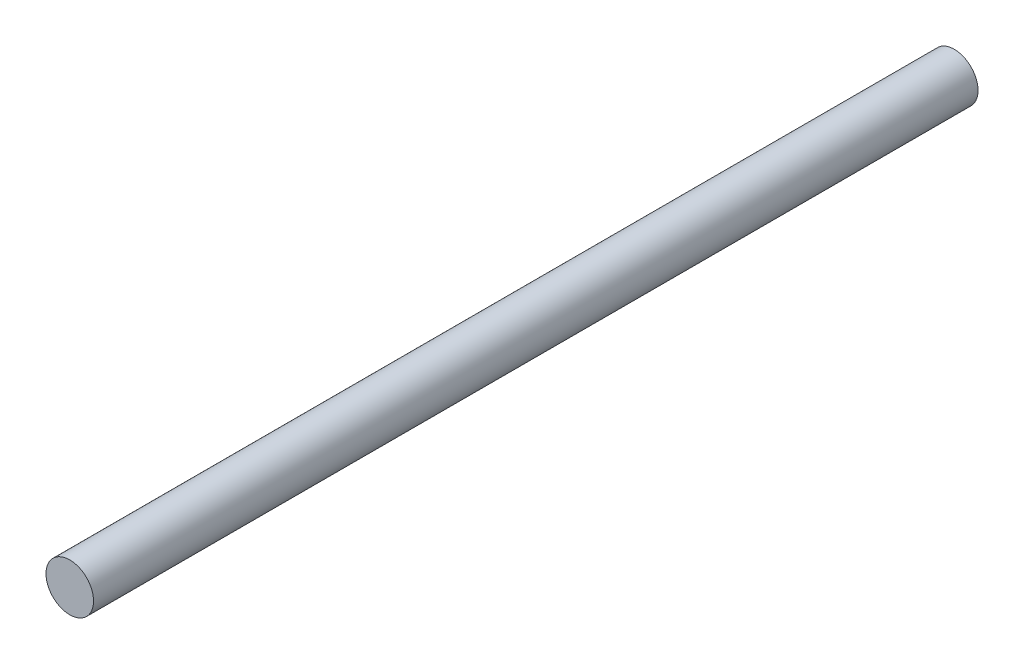
ISO-10303-21;
HEADER;
FILE_DESCRIPTION(('STEP AP214'),'2;1');
FILE_NAME('part.step','',(''),(''),'','','');
FILE_SCHEMA(('AUTOMOTIVE_DESIGN { 1 0 10303 214 1 1 1 1 }'));
ENDSEC;
DATA;
#1=APPLICATION_CONTEXT('core data for automotive mechanical design processes');
#2=APPLICATION_PROTOCOL_DEFINITION('international standard','automotive_design',2000,#1);
#3=PRODUCT_CONTEXT('',#1,'mechanical');
#4=PRODUCT('Part','Part','',(#3));
#5=PRODUCT_RELATED_PRODUCT_CATEGORY('part','',(#4));
#6=PRODUCT_DEFINITION_FORMATION('','',#4);
#7=PRODUCT_DEFINITION_CONTEXT('part definition',#1,'design');
#8=PRODUCT_DEFINITION('design','',#6,#7);
#9=PRODUCT_DEFINITION_SHAPE('','',#8);
#10=(LENGTH_UNIT() NAMED_UNIT(*) SI_UNIT(.MILLI.,.METRE.));
#11=(NAMED_UNIT(*) PLANE_ANGLE_UNIT() SI_UNIT($,.RADIAN.));
#12=(NAMED_UNIT(*) SI_UNIT($,.STERADIAN.) SOLID_ANGLE_UNIT());
#13=UNCERTAINTY_MEASURE_WITH_UNIT(LENGTH_MEASURE(1.E-05),#10,'distance_accuracy_value','');
#14=(GEOMETRIC_REPRESENTATION_CONTEXT(3) GLOBAL_UNCERTAINTY_ASSIGNED_CONTEXT((#13)) GLOBAL_UNIT_ASSIGNED_CONTEXT((#10,
#11,#12)) REPRESENTATION_CONTEXT('',''));
#15=CARTESIAN_POINT('',(0.,0.,0.));
#16=DIRECTION('',(0.,0.,1.));
#17=DIRECTION('',(1.,0.,0.));
#18=AXIS2_PLACEMENT_3D('',#15,#16,#17);
#19=CARTESIAN_POINT('',(0.,0.,93.));
#20=DIRECTION('',(0.,0.,-1.));
#21=DIRECTION('',(-1.,0.,0.));
#22=AXIS2_PLACEMENT_3D('',#19,#20,#21);
#23=CYLINDRICAL_SURFACE('',#22,2.5);
#24=CARTESIAN_POINT('',(0.,0.,93.));
#25=DIRECTION('',(0.,0.,1.));
#26=DIRECTION('',(1.,0.,0.));
#27=AXIS2_PLACEMENT_3D('',#24,#25,#26);
#28=CIRCLE('',#27,2.5);
#29=CARTESIAN_POINT('',(-2.5,0.,93.));
#30=VERTEX_POINT('',#29);
#31=EDGE_CURVE('E10',#30,#30,#28,.T.);
#32=CARTESIAN_POINT('',(0.,0.,0.));
#33=DIRECTION('',(0.,0.,1.));
#34=DIRECTION('',(1.,0.,0.));
#35=AXIS2_PLACEMENT_3D('',#32,#33,#34);
#36=CIRCLE('',#35,2.5);
#37=CARTESIAN_POINT('',(-2.5,0.,0.));
#38=VERTEX_POINT('',#37);
#39=EDGE_CURVE('E40',#38,#38,#36,.T.);
#40=CARTESIAN_POINT('',(-2.5,0.,93.));
#41=CARTESIAN_POINT('',(-2.5,0.,92.03125));
#42=CARTESIAN_POINT('',(-2.5,0.,91.0625));
#43=CARTESIAN_POINT('',(-2.5,0.,89.125));
#44=CARTESIAN_POINT('',(-2.5,0.,88.15625));
#45=CARTESIAN_POINT('',(-2.5,0.,86.21875));
#46=CARTESIAN_POINT('',(-2.5,0.,85.25));
#47=CARTESIAN_POINT('',(-2.5,0.,83.3125));
#48=CARTESIAN_POINT('',(-2.5,0.,82.34375));
#49=CARTESIAN_POINT('',(-2.5,0.,80.40625));
#50=CARTESIAN_POINT('',(-2.5,0.,79.4375));
#51=CARTESIAN_POINT('',(-2.5,0.,77.5));
#52=CARTESIAN_POINT('',(-2.5,0.,76.53125));
#53=CARTESIAN_POINT('',(-2.5,0.,74.59375));
#54=CARTESIAN_POINT('',(-2.5,0.,73.625));
#55=CARTESIAN_POINT('',(-2.5,0.,71.6875));
#56=CARTESIAN_POINT('',(-2.5,0.,70.71875));
#57=CARTESIAN_POINT('',(-2.5,0.,68.78125));
#58=CARTESIAN_POINT('',(-2.5,0.,67.8125));
#59=CARTESIAN_POINT('',(-2.5,0.,65.875));
#60=CARTESIAN_POINT('',(-2.5,0.,64.90625));
#61=CARTESIAN_POINT('',(-2.5,0.,62.96875));
#62=CARTESIAN_POINT('',(-2.5,0.,62.));
#63=CARTESIAN_POINT('',(-2.5,0.,60.0625));
#64=CARTESIAN_POINT('',(-2.5,0.,59.09375));
#65=CARTESIAN_POINT('',(-2.5,0.,57.15625));
#66=CARTESIAN_POINT('',(-2.5,0.,56.1875));
#67=CARTESIAN_POINT('',(-2.5,0.,54.25));
#68=CARTESIAN_POINT('',(-2.5,0.,53.28125));
#69=CARTESIAN_POINT('',(-2.5,0.,51.34375));
#70=CARTESIAN_POINT('',(-2.5,0.,50.375));
#71=CARTESIAN_POINT('',(-2.5,0.,48.4375));
#72=CARTESIAN_POINT('',(-2.5,0.,47.46875));
#73=CARTESIAN_POINT('',(-2.5,0.,45.53125));
#74=CARTESIAN_POINT('',(-2.5,0.,44.5625));
#75=CARTESIAN_POINT('',(-2.5,0.,42.625));
#76=CARTESIAN_POINT('',(-2.5,0.,41.65625));
#77=CARTESIAN_POINT('',(-2.5,0.,39.71875));
#78=CARTESIAN_POINT('',(-2.5,0.,38.75));
#79=CARTESIAN_POINT('',(-2.5,0.,36.8125));
#80=CARTESIAN_POINT('',(-2.5,0.,35.84375));
#81=CARTESIAN_POINT('',(-2.5,0.,33.90625));
#82=CARTESIAN_POINT('',(-2.5,0.,32.9375));
#83=CARTESIAN_POINT('',(-2.5,0.,31.));
#84=CARTESIAN_POINT('',(-2.5,0.,30.03125));
#85=CARTESIAN_POINT('',(-2.5,0.,28.09375));
#86=CARTESIAN_POINT('',(-2.5,0.,27.125));
#87=CARTESIAN_POINT('',(-2.5,0.,25.1875));
#88=CARTESIAN_POINT('',(-2.5,0.,24.21875));
#89=CARTESIAN_POINT('',(-2.5,0.,22.28125));
#90=CARTESIAN_POINT('',(-2.5,0.,21.3125));
#91=CARTESIAN_POINT('',(-2.5,0.,19.375));
#92=CARTESIAN_POINT('',(-2.5,0.,18.40625));
#93=CARTESIAN_POINT('',(-2.5,0.,16.46875));
#94=CARTESIAN_POINT('',(-2.5,0.,15.5));
#95=CARTESIAN_POINT('',(-2.5,0.,13.5625));
#96=CARTESIAN_POINT('',(-2.5,0.,12.59375));
#97=CARTESIAN_POINT('',(-2.5,0.,10.65625));
#98=CARTESIAN_POINT('',(-2.5,0.,9.68749999999998));
#99=CARTESIAN_POINT('',(-2.5,0.,7.74999999999998));
#100=CARTESIAN_POINT('',(-2.5,0.,6.78124999999998));
#101=CARTESIAN_POINT('',(-2.5,0.,4.84374999999998));
#102=CARTESIAN_POINT('',(-2.5,0.,3.87499999999999));
#103=CARTESIAN_POINT('',(-2.5,0.,1.93749999999999));
#104=CARTESIAN_POINT('',(-2.5,0.,0.968749999999985));
#105=CARTESIAN_POINT('',(-2.5,0.,0.));
#106=B_SPLINE_CURVE_WITH_KNOTS('',3,(#40,#41,#42,#43,#44,#45,#46,#47,#48,#49,#50,#51,#52,#53,
#54,#55,#56,#57,#58,#59,#60,#61,#62,#63,#64,#65,#66,#67,#68,#69,#70,#71,#72,#73,#74,#75,#76,#77,
#78,#79,#80,#81,#82,#83,#84,#85,#86,#87,#88,#89,#90,#91,#92,#93,#94,#95,#96,#97,#98,#99,#100,
#101,#102,#103,#104,#105),.UNSPECIFIED.,.F.,.F.,(4,2,2,2,2,2,2,2,2,2,2,2,2,2,2,2,2,2,2,2,2,2,2,
2,2,2,2,2,2,2,2,2,4),(0.,2.90625000000001,5.81250000000001,8.71875000000001,11.625,14.53125,
17.4375,20.34375,23.25,26.15625,29.0625,31.96875,34.875,37.78125,40.6875,43.59375,46.5,49.40625,
52.3125,55.21875,58.125,61.03125,63.9375,66.84375,69.75,72.65625,75.5625,78.46875,81.375,
84.28125,87.1875,90.09375,93.),.UNSPECIFIED.);
#107=EDGE_CURVE('BSEAM37',#30,#38,#106,.T.);
#108=ORIENTED_EDGE('',*,*,#31,.F.);
#109=ORIENTED_EDGE('',*,*,#39,.T.);
#110=ORIENTED_EDGE('',*,*,#107,.T.);
#111=ORIENTED_EDGE('',*,*,#107,.F.);
#112=EDGE_LOOP('',(#108,#110,#109,#111));
#113=FACE_BOUND('',#112,.T.);
#114=ADVANCED_FACE('F37',(#113),#23,.T.);
#115=CARTESIAN_POINT('',(0.,0.,93.));
#116=DIRECTION('',(0.,0.,1.));
#117=DIRECTION('',(1.,0.,0.));
#118=AXIS2_PLACEMENT_3D('',#115,#116,#117);
#119=PLANE('',#118);
#120=ORIENTED_EDGE('',*,*,#31,.T.);
#121=EDGE_LOOP('',(#120));
#122=FACE_BOUND('',#121,.T.);
#123=ADVANCED_FACE('F52',(#122),#119,.T.);
#124=CARTESIAN_POINT('',(0.,0.,0.));
#125=DIRECTION('',(0.,0.,1.));
#126=DIRECTION('',(1.,0.,0.));
#127=AXIS2_PLACEMENT_3D('',#124,#125,#126);
#128=PLANE('',#127);
#129=ORIENTED_EDGE('',*,*,#39,.F.);
#130=EDGE_LOOP('',(#129));
#131=FACE_BOUND('',#130,.T.);
#132=ADVANCED_FACE('F50',(#131),#128,.F.);
#133=CLOSED_SHELL('',(#114,#123,#132));
#134=MANIFOLD_SOLID_BREP('B2',#133);
#135=ADVANCED_BREP_SHAPE_REPRESENTATION('',(#18,#134),#14);
#136=SHAPE_DEFINITION_REPRESENTATION(#9,#135);
ENDSEC;
END-ISO-10303-21;
